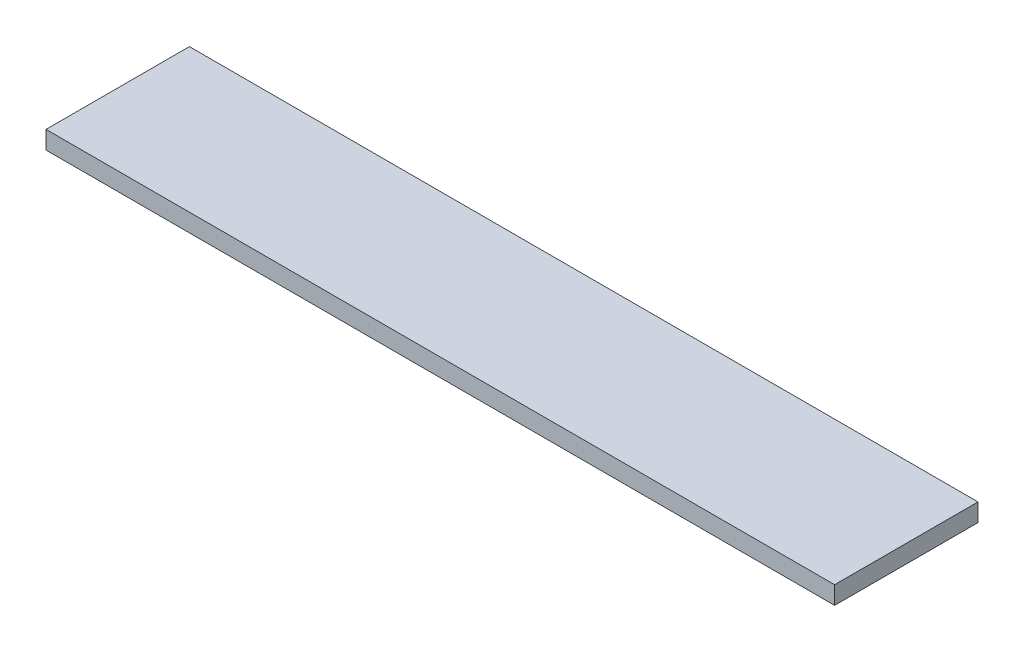
ISO-10303-21;
HEADER;
FILE_DESCRIPTION(('STEP AP214'),'2;1');
FILE_NAME('part.step','',(''),(''),'','','');
FILE_SCHEMA(('AUTOMOTIVE_DESIGN { 1 0 10303 214 1 1 1 1 }'));
ENDSEC;
DATA;
#1=APPLICATION_CONTEXT('core data for automotive mechanical design processes');
#2=APPLICATION_PROTOCOL_DEFINITION('international standard','automotive_design',2000,#1);
#3=PRODUCT_CONTEXT('',#1,'mechanical');
#4=PRODUCT('Part','Part','',(#3));
#5=PRODUCT_RELATED_PRODUCT_CATEGORY('part','',(#4));
#6=PRODUCT_DEFINITION_FORMATION('','',#4);
#7=PRODUCT_DEFINITION_CONTEXT('part definition',#1,'design');
#8=PRODUCT_DEFINITION('design','',#6,#7);
#9=PRODUCT_DEFINITION_SHAPE('','',#8);
#10=(LENGTH_UNIT() NAMED_UNIT(*) SI_UNIT(.MILLI.,.METRE.));
#11=(NAMED_UNIT(*) PLANE_ANGLE_UNIT() SI_UNIT($,.RADIAN.));
#12=(NAMED_UNIT(*) SI_UNIT($,.STERADIAN.) SOLID_ANGLE_UNIT());
#13=UNCERTAINTY_MEASURE_WITH_UNIT(LENGTH_MEASURE(1.E-05),#10,'distance_accuracy_value','');
#14=(GEOMETRIC_REPRESENTATION_CONTEXT(3) GLOBAL_UNCERTAINTY_ASSIGNED_CONTEXT((#13)) GLOBAL_UNIT_ASSIGNED_CONTEXT((#10,
#11,#12)) REPRESENTATION_CONTEXT('',''));
#15=CARTESIAN_POINT('',(0.,0.,0.));
#16=DIRECTION('',(0.,0.,1.));
#17=DIRECTION('',(1.,0.,0.));
#18=AXIS2_PLACEMENT_3D('',#15,#16,#17);
#19=CARTESIAN_POINT('',(130.,460.,-340.));
#20=DIRECTION('',(-1.,0.,0.));
#21=DIRECTION('',(0.,0.,1.));
#22=AXIS2_PLACEMENT_3D('',#19,#20,#21);
#23=PLANE('',#22);
#24=DIRECTION('',(0.,-1.,0.));
#25=VECTOR('',#24,1.);
#26=CARTESIAN_POINT('',(130.,460.,-260.));
#27=LINE('',#26,#25);
#28=CARTESIAN_POINT('',(130.,470.,-260.));
#29=VERTEX_POINT('',#28);
#30=CARTESIAN_POINT('',(130.,460.,-260.));
#31=VERTEX_POINT('',#30);
#32=EDGE_CURVE('E103',#29,#31,#27,.T.);
#33=ORIENTED_EDGE('',*,*,#32,.F.);
#34=DIRECTION('',(0.,0.,1.));
#35=VECTOR('',#34,1.);
#36=CARTESIAN_POINT('',(130.,470.,-340.));
#37=LINE('',#36,#35);
#38=CARTESIAN_POINT('',(130.,470.,-340.));
#39=VERTEX_POINT('',#38);
#40=EDGE_CURVE('E11',#39,#29,#37,.T.);
#41=ORIENTED_EDGE('',*,*,#40,.F.);
#42=DIRECTION('',(0.,-1.,0.));
#43=VECTOR('',#42,1.);
#44=CARTESIAN_POINT('',(130.,460.,-340.));
#45=LINE('',#44,#43);
#46=CARTESIAN_POINT('',(130.,460.,-340.));
#47=VERTEX_POINT('',#46);
#48=EDGE_CURVE('E97',#39,#47,#45,.T.);
#49=ORIENTED_EDGE('',*,*,#48,.T.);
#50=DIRECTION('',(0.,0.,1.));
#51=VECTOR('',#50,1.);
#52=CARTESIAN_POINT('',(130.,460.,-340.));
#53=LINE('',#52,#51);
#54=EDGE_CURVE('E42',#47,#31,#53,.T.);
#55=ORIENTED_EDGE('',*,*,#54,.T.);
#56=EDGE_LOOP('',(#33,#41,#49,#55));
#57=FACE_BOUND('',#56,.T.);
#58=ADVANCED_FACE('F39',(#57),#23,.T.);
#59=CARTESIAN_POINT('',(130.,470.,-340.));
#60=DIRECTION('',(0.,1.,0.));
#61=DIRECTION('',(0.,0.,1.));
#62=AXIS2_PLACEMENT_3D('',#59,#60,#61);
#63=PLANE('',#62);
#64=DIRECTION('',(-1.,0.,0.));
#65=VECTOR('',#64,1.);
#66=CARTESIAN_POINT('',(130.,470.,-260.));
#67=LINE('',#66,#65);
#68=CARTESIAN_POINT('',(570.,470.,-260.));
#69=VERTEX_POINT('',#68);
#70=EDGE_CURVE('E99',#69,#29,#67,.T.);
#71=ORIENTED_EDGE('',*,*,#70,.F.);
#72=DIRECTION('',(0.,0.,1.));
#73=VECTOR('',#72,1.);
#74=CARTESIAN_POINT('',(570.,470.,-340.));
#75=LINE('',#74,#73);
#76=CARTESIAN_POINT('',(570.,470.,-340.));
#77=VERTEX_POINT('',#76);
#78=EDGE_CURVE('E48',#77,#69,#75,.T.);
#79=ORIENTED_EDGE('',*,*,#78,.F.);
#80=DIRECTION('',(-1.,0.,0.));
#81=VECTOR('',#80,1.);
#82=CARTESIAN_POINT('',(130.,470.,-340.));
#83=LINE('',#82,#81);
#84=EDGE_CURVE('E94',#77,#39,#83,.T.);
#85=ORIENTED_EDGE('',*,*,#84,.T.);
#86=ORIENTED_EDGE('',*,*,#40,.T.);
#87=EDGE_LOOP('',(#71,#79,#85,#86));
#88=FACE_BOUND('',#87,.T.);
#89=ADVANCED_FACE('F113',(#88),#63,.T.);
#90=CARTESIAN_POINT('',(570.,460.,-340.));
#91=DIRECTION('',(1.,0.,0.));
#92=DIRECTION('',(0.,0.,-1.));
#93=AXIS2_PLACEMENT_3D('',#90,#91,#92);
#94=PLANE('',#93);
#95=DIRECTION('',(0.,1.,0.));
#96=VECTOR('',#95,1.);
#97=CARTESIAN_POINT('',(570.,460.,-260.));
#98=LINE('',#97,#96);
#99=CARTESIAN_POINT('',(570.,460.,-260.));
#100=VERTEX_POINT('',#99);
#101=EDGE_CURVE('E89',#100,#69,#98,.T.);
#102=ORIENTED_EDGE('',*,*,#101,.F.);
#103=DIRECTION('',(0.,0.,1.));
#104=VECTOR('',#103,1.);
#105=CARTESIAN_POINT('',(570.,460.,-340.));
#106=LINE('',#105,#104);
#107=CARTESIAN_POINT('',(570.,460.,-340.));
#108=VERTEX_POINT('',#107);
#109=EDGE_CURVE('E84',#108,#100,#106,.T.);
#110=ORIENTED_EDGE('',*,*,#109,.F.);
#111=DIRECTION('',(0.,1.,0.));
#112=VECTOR('',#111,1.);
#113=CARTESIAN_POINT('',(570.,460.,-340.));
#114=LINE('',#113,#112);
#115=EDGE_CURVE('E87',#108,#77,#114,.T.);
#116=ORIENTED_EDGE('',*,*,#115,.T.);
#117=ORIENTED_EDGE('',*,*,#78,.T.);
#118=EDGE_LOOP('',(#102,#110,#116,#117));
#119=FACE_BOUND('',#118,.T.);
#120=ADVANCED_FACE('F86',(#119),#94,.T.);
#121=CARTESIAN_POINT('',(130.,460.,-340.));
#122=DIRECTION('',(0.,-1.,0.));
#123=DIRECTION('',(0.,0.,-1.));
#124=AXIS2_PLACEMENT_3D('',#121,#122,#123);
#125=PLANE('',#124);
#126=DIRECTION('',(1.,0.,0.));
#127=VECTOR('',#126,1.);
#128=CARTESIAN_POINT('',(130.,460.,-260.));
#129=LINE('',#128,#127);
#130=EDGE_CURVE('E106',#31,#100,#129,.T.);
#131=ORIENTED_EDGE('',*,*,#130,.F.);
#132=ORIENTED_EDGE('',*,*,#54,.F.);
#133=DIRECTION('',(1.,0.,0.));
#134=VECTOR('',#133,1.);
#135=CARTESIAN_POINT('',(130.,460.,-340.));
#136=LINE('',#135,#134);
#137=EDGE_CURVE('E93',#47,#108,#136,.T.);
#138=ORIENTED_EDGE('',*,*,#137,.T.);
#139=ORIENTED_EDGE('',*,*,#109,.T.);
#140=EDGE_LOOP('',(#131,#132,#138,#139));
#141=FACE_BOUND('',#140,.T.);
#142=ADVANCED_FACE('F96',(#141),#125,.T.);
#143=CARTESIAN_POINT('',(0.,0.,-340.));
#144=DIRECTION('',(0.,0.,-1.));
#145=DIRECTION('',(-1.,0.,0.));
#146=AXIS2_PLACEMENT_3D('',#143,#144,#145);
#147=PLANE('',#146);
#148=ORIENTED_EDGE('',*,*,#48,.F.);
#149=ORIENTED_EDGE('',*,*,#84,.F.);
#150=ORIENTED_EDGE('',*,*,#115,.F.);
#151=ORIENTED_EDGE('',*,*,#137,.F.);
#152=EDGE_LOOP('',(#148,#149,#150,#151));
#153=FACE_BOUND('',#152,.T.);
#154=ADVANCED_FACE('F92',(#153),#147,.T.);
#155=CARTESIAN_POINT('',(0.,0.,-260.));
#156=DIRECTION('',(0.,0.,-1.));
#157=DIRECTION('',(-1.,0.,0.));
#158=AXIS2_PLACEMENT_3D('',#155,#156,#157);
#159=PLANE('',#158);
#160=ORIENTED_EDGE('',*,*,#32,.T.);
#161=ORIENTED_EDGE('',*,*,#130,.T.);
#162=ORIENTED_EDGE('',*,*,#101,.T.);
#163=ORIENTED_EDGE('',*,*,#70,.T.);
#164=EDGE_LOOP('',(#160,#161,#162,#163));
#165=FACE_BOUND('',#164,.T.);
#166=ADVANCED_FACE('F112',(#165),#159,.F.);
#167=CLOSED_SHELL('',(#58,#89,#120,#142,#154,#166));
#168=MANIFOLD_SOLID_BREP('B2',#167);
#169=ADVANCED_BREP_SHAPE_REPRESENTATION('',(#18,#168),#14);
#170=SHAPE_DEFINITION_REPRESENTATION(#9,#169);
ENDSEC;
END-ISO-10303-21;
